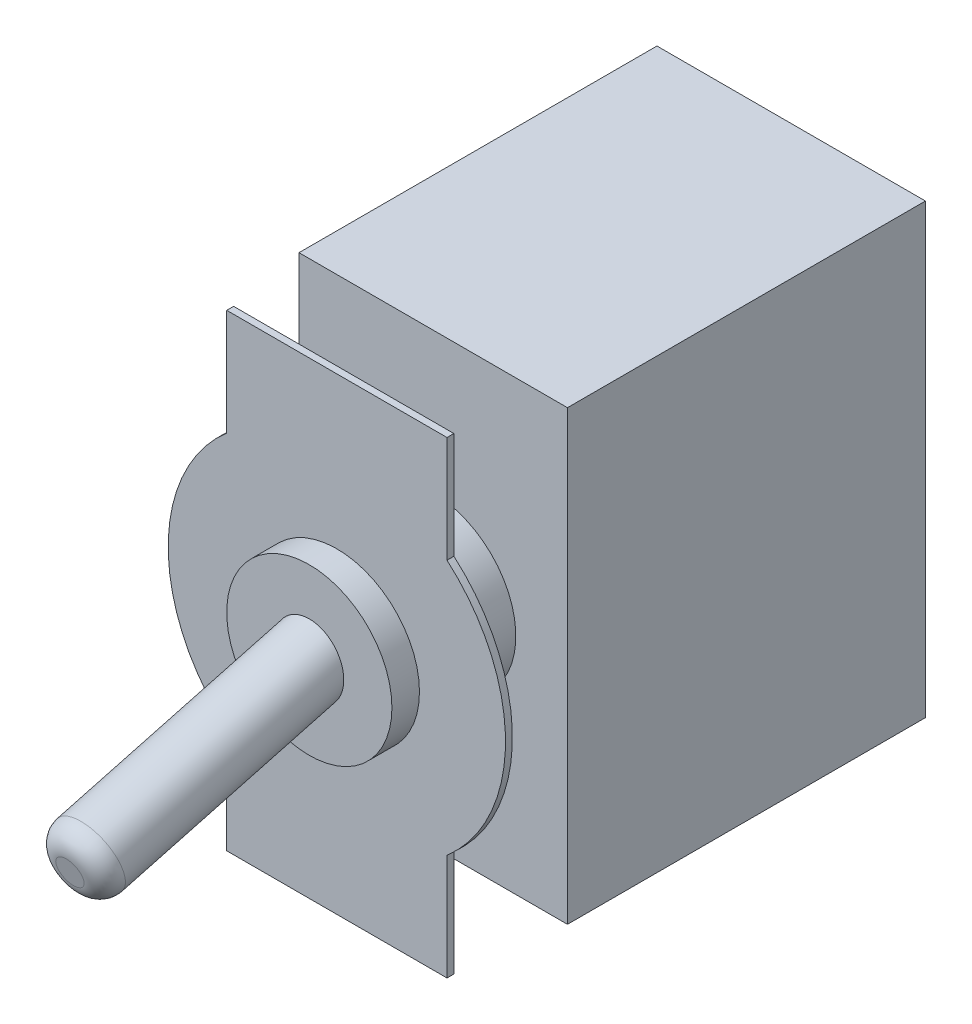
ISO-10303-21;
HEADER;
FILE_DESCRIPTION(('STEP AP214'),'2;1');
FILE_NAME('part.step','',(''),(''),'','','');
FILE_SCHEMA(('AUTOMOTIVE_DESIGN { 1 0 10303 214 1 1 1 1 }'));
ENDSEC;
DATA;
#1=APPLICATION_CONTEXT('core data for automotive mechanical design processes');
#2=APPLICATION_PROTOCOL_DEFINITION('international standard','automotive_design',2000,#1);
#3=PRODUCT_CONTEXT('',#1,'mechanical');
#4=PRODUCT('Part','Part','',(#3));
#5=PRODUCT_RELATED_PRODUCT_CATEGORY('part','',(#4));
#6=PRODUCT_DEFINITION_FORMATION('','',#4);
#7=PRODUCT_DEFINITION_CONTEXT('part definition',#1,'design');
#8=PRODUCT_DEFINITION('design','',#6,#7);
#9=PRODUCT_DEFINITION_SHAPE('','',#8);
#10=(LENGTH_UNIT() NAMED_UNIT(*) SI_UNIT(.MILLI.,.METRE.));
#11=(NAMED_UNIT(*) PLANE_ANGLE_UNIT() SI_UNIT($,.RADIAN.));
#12=(NAMED_UNIT(*) SI_UNIT($,.STERADIAN.) SOLID_ANGLE_UNIT());
#13=UNCERTAINTY_MEASURE_WITH_UNIT(LENGTH_MEASURE(1.E-05),#10,'distance_accuracy_value','');
#14=(GEOMETRIC_REPRESENTATION_CONTEXT(3) GLOBAL_UNCERTAINTY_ASSIGNED_CONTEXT((#13)) GLOBAL_UNIT_ASSIGNED_CONTEXT((#10,
#11,#12)) REPRESENTATION_CONTEXT('',''));
#15=CARTESIAN_POINT('',(0.,0.,0.));
#16=DIRECTION('',(0.,0.,1.));
#17=DIRECTION('',(1.,0.,0.));
#18=AXIS2_PLACEMENT_3D('',#15,#16,#17);
#19=CARTESIAN_POINT('',(0.,0.,35.));
#20=DIRECTION('',(0.,0.,-1.));
#21=DIRECTION('',(-1.,0.,0.));
#22=AXIS2_PLACEMENT_3D('',#19,#20,#21);
#23=CYLINDRICAL_SURFACE('',#22,6.);
#24=CARTESIAN_POINT('',(0.,0.,26.));
#25=DIRECTION('',(0.,0.,-1.));
#26=DIRECTION('',(-1.,0.,0.));
#27=AXIS2_PLACEMENT_3D('',#24,#25,#26);
#28=CIRCLE('',#27,6.);
#29=CARTESIAN_POINT('',(-6.,0.,26.));
#30=VERTEX_POINT('',#29);
#31=EDGE_CURVE('E238',#30,#30,#28,.F.);
#32=ORIENTED_EDGE('',*,*,#31,.T.);
#33=EDGE_LOOP('',(#32));
#34=FACE_BOUND('',#33,.T.);
#35=CARTESIAN_POINT('',(0.,0.,32.5));
#36=DIRECTION('',(0.,0.,1.));
#37=DIRECTION('',(1.,0.,0.));
#38=AXIS2_PLACEMENT_3D('',#35,#36,#37);
#39=CIRCLE('',#38,6.);
#40=CARTESIAN_POINT('',(6.,0.,32.5));
#41=VERTEX_POINT('',#40);
#42=EDGE_CURVE('E241',#41,#41,#39,.T.);
#43=ORIENTED_EDGE('',*,*,#42,.F.);
#44=EDGE_LOOP('',(#43));
#45=FACE_BOUND('',#44,.T.);
#46=ADVANCED_FACE('F38',(#34,#45),#23,.T.);
#47=CARTESIAN_POINT('',(9.75,-16.25,26.));
#48=DIRECTION('',(-1.,0.,0.));
#49=DIRECTION('',(0.,0.,1.));
#50=AXIS2_PLACEMENT_3D('',#47,#48,#49);
#51=PLANE('',#50);
#52=DIRECTION('',(0.,1.,0.));
#53=VECTOR('',#52,1.);
#54=CARTESIAN_POINT('',(9.75,-16.25,0.));
#55=LINE('',#54,#53);
#56=CARTESIAN_POINT('',(9.75,-16.25,0.));
#57=VERTEX_POINT('',#56);
#58=CARTESIAN_POINT('',(9.75,16.25,0.));
#59=VERTEX_POINT('',#58);
#60=EDGE_CURVE('E217',#57,#59,#55,.T.);
#61=ORIENTED_EDGE('',*,*,#60,.T.);
#62=DIRECTION('',(0.,0.,-1.));
#63=VECTOR('',#62,1.);
#64=CARTESIAN_POINT('',(9.75,16.25,26.));
#65=LINE('',#64,#63);
#66=CARTESIAN_POINT('',(9.75,16.25,26.));
#67=VERTEX_POINT('',#66);
#68=EDGE_CURVE('E236',#67,#59,#65,.T.);
#69=ORIENTED_EDGE('',*,*,#68,.F.);
#70=DIRECTION('',(0.,1.,0.));
#71=VECTOR('',#70,1.);
#72=CARTESIAN_POINT('',(9.75,-16.25,26.));
#73=LINE('',#72,#71);
#74=CARTESIAN_POINT('',(9.75,-16.25,26.));
#75=VERTEX_POINT('',#74);
#76=EDGE_CURVE('E218',#75,#67,#73,.T.);
#77=ORIENTED_EDGE('',*,*,#76,.F.);
#78=DIRECTION('',(0.,0.,-1.));
#79=VECTOR('',#78,1.);
#80=CARTESIAN_POINT('',(9.75,-16.25,26.));
#81=LINE('',#80,#79);
#82=EDGE_CURVE('E224',#75,#57,#81,.T.);
#83=ORIENTED_EDGE('',*,*,#82,.T.);
#84=EDGE_LOOP('',(#61,#69,#77,#83));
#85=FACE_BOUND('',#84,.T.);
#86=ADVANCED_FACE('F266',(#85),#51,.F.);
#87=CARTESIAN_POINT('',(-9.75,16.25,26.));
#88=DIRECTION('',(0.,-1.,0.));
#89=DIRECTION('',(0.,0.,-1.));
#90=AXIS2_PLACEMENT_3D('',#87,#88,#89);
#91=PLANE('',#90);
#92=DIRECTION('',(-1.,0.,0.));
#93=VECTOR('',#92,1.);
#94=CARTESIAN_POINT('',(-9.75,16.25,0.));
#95=LINE('',#94,#93);
#96=CARTESIAN_POINT('',(-9.75,16.25,0.));
#97=VERTEX_POINT('',#96);
#98=EDGE_CURVE('E227',#59,#97,#95,.T.);
#99=ORIENTED_EDGE('',*,*,#98,.T.);
#100=DIRECTION('',(0.,0.,-1.));
#101=VECTOR('',#100,1.);
#102=CARTESIAN_POINT('',(-9.75,16.25,26.));
#103=LINE('',#102,#101);
#104=CARTESIAN_POINT('',(-9.75,16.25,26.));
#105=VERTEX_POINT('',#104);
#106=EDGE_CURVE('E234',#105,#97,#103,.T.);
#107=ORIENTED_EDGE('',*,*,#106,.F.);
#108=DIRECTION('',(-1.,0.,0.));
#109=VECTOR('',#108,1.);
#110=CARTESIAN_POINT('',(-9.75,16.25,26.));
#111=LINE('',#110,#109);
#112=EDGE_CURVE('E87',#67,#105,#111,.T.);
#113=ORIENTED_EDGE('',*,*,#112,.F.);
#114=ORIENTED_EDGE('',*,*,#68,.T.);
#115=EDGE_LOOP('',(#99,#107,#113,#114));
#116=FACE_BOUND('',#115,.T.);
#117=ADVANCED_FACE('F272',(#116),#91,.F.);
#118=CARTESIAN_POINT('',(-9.75,-16.25,26.));
#119=DIRECTION('',(1.,0.,0.));
#120=DIRECTION('',(0.,0.,-1.));
#121=AXIS2_PLACEMENT_3D('',#118,#119,#120);
#122=PLANE('',#121);
#123=DIRECTION('',(0.,-1.,0.));
#124=VECTOR('',#123,1.);
#125=CARTESIAN_POINT('',(-9.75,-16.25,0.));
#126=LINE('',#125,#124);
#127=CARTESIAN_POINT('',(-9.75,-16.25,0.));
#128=VERTEX_POINT('',#127);
#129=EDGE_CURVE('E73',#97,#128,#126,.T.);
#130=ORIENTED_EDGE('',*,*,#129,.T.);
#131=DIRECTION('',(0.,0.,-1.));
#132=VECTOR('',#131,1.);
#133=CARTESIAN_POINT('',(-9.75,-16.25,26.));
#134=LINE('',#133,#132);
#135=CARTESIAN_POINT('',(-9.75,-16.25,26.));
#136=VERTEX_POINT('',#135);
#137=EDGE_CURVE('E232',#136,#128,#134,.T.);
#138=ORIENTED_EDGE('',*,*,#137,.F.);
#139=DIRECTION('',(0.,-1.,0.));
#140=VECTOR('',#139,1.);
#141=CARTESIAN_POINT('',(-9.75,-16.25,26.));
#142=LINE('',#141,#140);
#143=EDGE_CURVE('E221',#105,#136,#142,.T.);
#144=ORIENTED_EDGE('',*,*,#143,.F.);
#145=ORIENTED_EDGE('',*,*,#106,.T.);
#146=EDGE_LOOP('',(#130,#138,#144,#145));
#147=FACE_BOUND('',#146,.T.);
#148=ADVANCED_FACE('F343',(#147),#122,.F.);
#149=CARTESIAN_POINT('',(-9.75,-16.25,26.));
#150=DIRECTION('',(0.,1.,0.));
#151=DIRECTION('',(0.,0.,1.));
#152=AXIS2_PLACEMENT_3D('',#149,#150,#151);
#153=PLANE('',#152);
#154=DIRECTION('',(1.,0.,0.));
#155=VECTOR('',#154,1.);
#156=CARTESIAN_POINT('',(-9.75,-16.25,0.));
#157=LINE('',#156,#155);
#158=EDGE_CURVE('E79',#128,#57,#157,.T.);
#159=ORIENTED_EDGE('',*,*,#158,.T.);
#160=ORIENTED_EDGE('',*,*,#82,.F.);
#161=DIRECTION('',(1.,0.,0.));
#162=VECTOR('',#161,1.);
#163=CARTESIAN_POINT('',(-9.75,-16.25,26.));
#164=LINE('',#163,#162);
#165=EDGE_CURVE('E55',#136,#75,#164,.T.);
#166=ORIENTED_EDGE('',*,*,#165,.F.);
#167=ORIENTED_EDGE('',*,*,#137,.T.);
#168=EDGE_LOOP('',(#159,#160,#166,#167));
#169=FACE_BOUND('',#168,.T.);
#170=ADVANCED_FACE('F337',(#169),#153,.F.);
#171=CARTESIAN_POINT('',(0.,0.,26.));
#172=DIRECTION('',(0.,0.,-1.));
#173=DIRECTION('',(-1.,0.,0.));
#174=AXIS2_PLACEMENT_3D('',#171,#172,#173);
#175=PLANE('',#174);
#176=ORIENTED_EDGE('',*,*,#31,.F.);
#177=EDGE_LOOP('',(#176));
#178=FACE_BOUND('',#177,.T.);
#179=ORIENTED_EDGE('',*,*,#76,.T.);
#180=ORIENTED_EDGE('',*,*,#112,.T.);
#181=ORIENTED_EDGE('',*,*,#143,.T.);
#182=ORIENTED_EDGE('',*,*,#165,.T.);
#183=EDGE_LOOP('',(#179,#180,#181,#182));
#184=FACE_BOUND('',#183,.T.);
#185=ADVANCED_FACE('F331',(#178,#184),#175,.F.);
#186=CARTESIAN_POINT('',(0.,0.,0.));
#187=DIRECTION('',(0.,0.,-1.));
#188=DIRECTION('',(-1.,0.,0.));
#189=AXIS2_PLACEMENT_3D('',#186,#187,#188);
#190=PLANE('',#189);
#191=ORIENTED_EDGE('',*,*,#60,.F.);
#192=ORIENTED_EDGE('',*,*,#158,.F.);
#193=ORIENTED_EDGE('',*,*,#129,.F.);
#194=ORIENTED_EDGE('',*,*,#98,.F.);
#195=EDGE_LOOP('',(#191,#192,#193,#194));
#196=FACE_BOUND('',#195,.T.);
#197=ADVANCED_FACE('F324',(#196),#190,.T.);
#198=CARTESIAN_POINT('',(-8.,17.,32.5));
#199=DIRECTION('',(0.,1.,0.));
#200=DIRECTION('',(0.,0.,1.));
#201=AXIS2_PLACEMENT_3D('',#198,#199,#200);
#202=PLANE('',#201);
#203=DIRECTION('',(-1.,0.,0.));
#204=VECTOR('',#203,1.);
#205=CARTESIAN_POINT('',(-8.,17.,33.));
#206=LINE('',#205,#204);
#207=CARTESIAN_POINT('',(8.,17.,33.));
#208=VERTEX_POINT('',#207);
#209=CARTESIAN_POINT('',(-8.,17.,33.));
#210=VERTEX_POINT('',#209);
#211=EDGE_CURVE('E184',#208,#210,#206,.T.);
#212=ORIENTED_EDGE('',*,*,#211,.F.);
#213=DIRECTION('',(0.,0.,1.));
#214=VECTOR('',#213,1.);
#215=CARTESIAN_POINT('',(8.,17.,32.5));
#216=LINE('',#215,#214);
#217=CARTESIAN_POINT('',(8.,17.,32.5));
#218=VERTEX_POINT('',#217);
#219=EDGE_CURVE('E163',#218,#208,#216,.T.);
#220=ORIENTED_EDGE('',*,*,#219,.F.);
#221=DIRECTION('',(-1.,0.,0.));
#222=VECTOR('',#221,1.);
#223=CARTESIAN_POINT('',(-8.,17.,32.5));
#224=LINE('',#223,#222);
#225=CARTESIAN_POINT('',(-8.,17.,32.5));
#226=VERTEX_POINT('',#225);
#227=EDGE_CURVE('E156',#218,#226,#224,.T.);
#228=ORIENTED_EDGE('',*,*,#227,.T.);
#229=DIRECTION('',(0.,0.,1.));
#230=VECTOR('',#229,1.);
#231=CARTESIAN_POINT('',(-8.,17.,32.5));
#232=LINE('',#231,#230);
#233=EDGE_CURVE('E138',#226,#210,#232,.T.);
#234=ORIENTED_EDGE('',*,*,#233,.T.);
#235=EDGE_LOOP('',(#212,#220,#228,#234));
#236=FACE_BOUND('',#235,.T.);
#237=ADVANCED_FACE('F162',(#236),#202,.T.);
#238=CARTESIAN_POINT('',(8.,9.27698765763974,32.5));
#239=DIRECTION('',(1.,0.,0.));
#240=DIRECTION('',(0.,0.,-1.));
#241=AXIS2_PLACEMENT_3D('',#238,#239,#240);
#242=PLANE('',#241);
#243=DIRECTION('',(0.,1.,0.));
#244=VECTOR('',#243,1.);
#245=CARTESIAN_POINT('',(8.,9.27698765763974,33.));
#246=LINE('',#245,#244);
#247=CARTESIAN_POINT('',(8.,9.27698765763974,33.));
#248=VERTEX_POINT('',#247);
#249=EDGE_CURVE('E164',#248,#208,#246,.T.);
#250=ORIENTED_EDGE('',*,*,#249,.F.);
#251=DIRECTION('',(0.,0.,1.));
#252=VECTOR('',#251,1.);
#253=CARTESIAN_POINT('',(8.,9.27698765763974,32.5));
#254=LINE('',#253,#252);
#255=CARTESIAN_POINT('',(8.,9.27698765763974,32.5));
#256=VERTEX_POINT('',#255);
#257=EDGE_CURVE('E203',#256,#248,#254,.T.);
#258=ORIENTED_EDGE('',*,*,#257,.F.);
#259=DIRECTION('',(0.,1.,0.));
#260=VECTOR('',#259,1.);
#261=CARTESIAN_POINT('',(8.,9.27698765763974,32.5));
#262=LINE('',#261,#260);
#263=EDGE_CURVE('E149',#256,#218,#262,.T.);
#264=ORIENTED_EDGE('',*,*,#263,.T.);
#265=ORIENTED_EDGE('',*,*,#219,.T.);
#266=EDGE_LOOP('',(#250,#258,#264,#265));
#267=FACE_BOUND('',#266,.T.);
#268=ADVANCED_FACE('F296',(#267),#242,.T.);
#269=CARTESIAN_POINT('',(0.,0.,32.5));
#270=DIRECTION('',(0.,0.,1.));
#271=DIRECTION('',(1.,0.,0.));
#272=AXIS2_PLACEMENT_3D('',#269,#270,#271);
#273=CYLINDRICAL_SURFACE('',#272,12.25);
#274=CARTESIAN_POINT('',(0.,0.,33.));
#275=DIRECTION('',(0.,0.,1.));
#276=DIRECTION('',(1.,0.,0.));
#277=AXIS2_PLACEMENT_3D('',#274,#275,#276);
#278=CIRCLE('',#277,12.25);
#279=CARTESIAN_POINT('',(8.,-9.27698765763974,33.));
#280=VERTEX_POINT('',#279);
#281=EDGE_CURVE('E167',#280,#248,#278,.T.);
#282=ORIENTED_EDGE('',*,*,#281,.F.);
#283=DIRECTION('',(0.,0.,1.));
#284=VECTOR('',#283,1.);
#285=CARTESIAN_POINT('',(8.,-9.27698765763974,32.5));
#286=LINE('',#285,#284);
#287=CARTESIAN_POINT('',(8.,-9.27698765763974,32.5));
#288=VERTEX_POINT('',#287);
#289=EDGE_CURVE('E205',#288,#280,#286,.T.);
#290=ORIENTED_EDGE('',*,*,#289,.F.);
#291=CARTESIAN_POINT('',(0.,0.,32.5));
#292=DIRECTION('',(0.,0.,1.));
#293=DIRECTION('',(1.,0.,0.));
#294=AXIS2_PLACEMENT_3D('',#291,#292,#293);
#295=CIRCLE('',#294,12.25);
#296=EDGE_CURVE('E180',#288,#256,#295,.T.);
#297=ORIENTED_EDGE('',*,*,#296,.T.);
#298=ORIENTED_EDGE('',*,*,#257,.T.);
#299=EDGE_LOOP('',(#282,#290,#297,#298));
#300=FACE_BOUND('',#299,.T.);
#301=ADVANCED_FACE('F329',(#300),#273,.T.);
#302=CARTESIAN_POINT('',(8.,-17.,32.5));
#303=DIRECTION('',(1.,0.,0.));
#304=DIRECTION('',(0.,0.,-1.));
#305=AXIS2_PLACEMENT_3D('',#302,#303,#304);
#306=PLANE('',#305);
#307=DIRECTION('',(0.,1.,0.));
#308=VECTOR('',#307,1.);
#309=CARTESIAN_POINT('',(8.,-17.,33.));
#310=LINE('',#309,#308);
#311=CARTESIAN_POINT('',(8.,-17.,33.));
#312=VERTEX_POINT('',#311);
#313=EDGE_CURVE('E196',#312,#280,#310,.T.);
#314=ORIENTED_EDGE('',*,*,#313,.F.);
#315=DIRECTION('',(0.,0.,1.));
#316=VECTOR('',#315,1.);
#317=CARTESIAN_POINT('',(8.,-17.,32.5));
#318=LINE('',#317,#316);
#319=CARTESIAN_POINT('',(8.,-17.,32.5));
#320=VERTEX_POINT('',#319);
#321=EDGE_CURVE('E207',#320,#312,#318,.T.);
#322=ORIENTED_EDGE('',*,*,#321,.F.);
#323=DIRECTION('',(0.,1.,0.));
#324=VECTOR('',#323,1.);
#325=CARTESIAN_POINT('',(8.,-17.,32.5));
#326=LINE('',#325,#324);
#327=EDGE_CURVE('E177',#320,#288,#326,.T.);
#328=ORIENTED_EDGE('',*,*,#327,.T.);
#329=ORIENTED_EDGE('',*,*,#289,.T.);
#330=EDGE_LOOP('',(#314,#322,#328,#329));
#331=FACE_BOUND('',#330,.T.);
#332=ADVANCED_FACE('F303',(#331),#306,.T.);
#333=CARTESIAN_POINT('',(-8.,-17.,32.5));
#334=DIRECTION('',(0.,-1.,0.));
#335=DIRECTION('',(0.,0.,-1.));
#336=AXIS2_PLACEMENT_3D('',#333,#334,#335);
#337=PLANE('',#336);
#338=DIRECTION('',(1.,0.,0.));
#339=VECTOR('',#338,1.);
#340=CARTESIAN_POINT('',(-8.,-17.,33.));
#341=LINE('',#340,#339);
#342=CARTESIAN_POINT('',(-8.,-17.,33.));
#343=VERTEX_POINT('',#342);
#344=EDGE_CURVE('E193',#343,#312,#341,.T.);
#345=ORIENTED_EDGE('',*,*,#344,.F.);
#346=DIRECTION('',(0.,0.,1.));
#347=VECTOR('',#346,1.);
#348=CARTESIAN_POINT('',(-8.,-17.,32.5));
#349=LINE('',#348,#347);
#350=CARTESIAN_POINT('',(-8.,-17.,32.5));
#351=VERTEX_POINT('',#350);
#352=EDGE_CURVE('E209',#351,#343,#349,.T.);
#353=ORIENTED_EDGE('',*,*,#352,.F.);
#354=DIRECTION('',(1.,0.,0.));
#355=VECTOR('',#354,1.);
#356=CARTESIAN_POINT('',(-8.,-17.,32.5));
#357=LINE('',#356,#355);
#358=EDGE_CURVE('E174',#351,#320,#357,.T.);
#359=ORIENTED_EDGE('',*,*,#358,.T.);
#360=ORIENTED_EDGE('',*,*,#321,.T.);
#361=EDGE_LOOP('',(#345,#353,#359,#360));
#362=FACE_BOUND('',#361,.T.);
#363=ADVANCED_FACE('F306',(#362),#337,.T.);
#364=CARTESIAN_POINT('',(-8.,-17.,32.5));
#365=DIRECTION('',(-1.,0.,0.));
#366=DIRECTION('',(0.,0.,1.));
#367=AXIS2_PLACEMENT_3D('',#364,#365,#366);
#368=PLANE('',#367);
#369=DIRECTION('',(0.,-1.,0.));
#370=VECTOR('',#369,1.);
#371=CARTESIAN_POINT('',(-8.,-17.,33.));
#372=LINE('',#371,#370);
#373=CARTESIAN_POINT('',(-8.,-9.27698765763973,33.));
#374=VERTEX_POINT('',#373);
#375=EDGE_CURVE('E190',#374,#343,#372,.T.);
#376=ORIENTED_EDGE('',*,*,#375,.F.);
#377=DIRECTION('',(0.,0.,1.));
#378=VECTOR('',#377,1.);
#379=CARTESIAN_POINT('',(-8.,-9.27698765763973,32.5));
#380=LINE('',#379,#378);
#381=CARTESIAN_POINT('',(-8.,-9.27698765763973,32.5));
#382=VERTEX_POINT('',#381);
#383=EDGE_CURVE('E211',#382,#374,#380,.T.);
#384=ORIENTED_EDGE('',*,*,#383,.F.);
#385=DIRECTION('',(0.,-1.,0.));
#386=VECTOR('',#385,1.);
#387=CARTESIAN_POINT('',(-8.,-17.,32.5));
#388=LINE('',#387,#386);
#389=EDGE_CURVE('E171',#382,#351,#388,.T.);
#390=ORIENTED_EDGE('',*,*,#389,.T.);
#391=ORIENTED_EDGE('',*,*,#352,.T.);
#392=EDGE_LOOP('',(#376,#384,#390,#391));
#393=FACE_BOUND('',#392,.T.);
#394=ADVANCED_FACE('F309',(#393),#368,.T.);
#395=CARTESIAN_POINT('',(0.,0.,32.5));
#396=DIRECTION('',(0.,0.,1.));
#397=DIRECTION('',(1.,0.,0.));
#398=AXIS2_PLACEMENT_3D('',#395,#396,#397);
#399=CYLINDRICAL_SURFACE('',#398,12.25);
#400=CARTESIAN_POINT('',(0.,0.,33.));
#401=DIRECTION('',(0.,0.,1.));
#402=DIRECTION('',(1.,0.,0.));
#403=AXIS2_PLACEMENT_3D('',#400,#401,#402);
#404=CIRCLE('',#403,12.25);
#405=CARTESIAN_POINT('',(-8.,9.27698765763974,33.));
#406=VERTEX_POINT('',#405);
#407=EDGE_CURVE('E187',#406,#374,#404,.T.);
#408=ORIENTED_EDGE('',*,*,#407,.F.);
#409=DIRECTION('',(0.,0.,1.));
#410=VECTOR('',#409,1.);
#411=CARTESIAN_POINT('',(-8.,9.27698765763974,32.5));
#412=LINE('',#411,#410);
#413=CARTESIAN_POINT('',(-8.,9.27698765763974,32.5));
#414=VERTEX_POINT('',#413);
#415=EDGE_CURVE('E148',#414,#406,#412,.T.);
#416=ORIENTED_EDGE('',*,*,#415,.F.);
#417=CARTESIAN_POINT('',(0.,0.,32.5));
#418=DIRECTION('',(0.,0.,1.));
#419=DIRECTION('',(1.,0.,0.));
#420=AXIS2_PLACEMENT_3D('',#417,#418,#419);
#421=CIRCLE('',#420,12.25);
#422=EDGE_CURVE('E160',#414,#382,#421,.T.);
#423=ORIENTED_EDGE('',*,*,#422,.T.);
#424=ORIENTED_EDGE('',*,*,#383,.T.);
#425=EDGE_LOOP('',(#408,#416,#423,#424));
#426=FACE_BOUND('',#425,.T.);
#427=ADVANCED_FACE('F312',(#426),#399,.T.);
#428=CARTESIAN_POINT('',(-8.,9.27698765763974,32.5));
#429=DIRECTION('',(-1.,0.,0.));
#430=DIRECTION('',(0.,0.,1.));
#431=AXIS2_PLACEMENT_3D('',#428,#429,#430);
#432=PLANE('',#431);
#433=DIRECTION('',(0.,-1.,0.));
#434=VECTOR('',#433,1.);
#435=CARTESIAN_POINT('',(-8.,9.27698765763974,33.));
#436=LINE('',#435,#434);
#437=EDGE_CURVE('E143',#210,#406,#436,.T.);
#438=ORIENTED_EDGE('',*,*,#437,.F.);
#439=ORIENTED_EDGE('',*,*,#233,.F.);
#440=DIRECTION('',(0.,-1.,0.));
#441=VECTOR('',#440,1.);
#442=CARTESIAN_POINT('',(-8.,9.27698765763974,32.5));
#443=LINE('',#442,#441);
#444=EDGE_CURVE('E141',#226,#414,#443,.T.);
#445=ORIENTED_EDGE('',*,*,#444,.T.);
#446=ORIENTED_EDGE('',*,*,#415,.T.);
#447=EDGE_LOOP('',(#438,#439,#445,#446));
#448=FACE_BOUND('',#447,.T.);
#449=ADVANCED_FACE('F140',(#448),#432,.T.);
#450=CARTESIAN_POINT('',(0.,0.,32.5));
#451=DIRECTION('',(0.,0.,1.));
#452=DIRECTION('',(1.,0.,0.));
#453=AXIS2_PLACEMENT_3D('',#450,#451,#452);
#454=PLANE('',#453);
#455=ORIENTED_EDGE('',*,*,#42,.T.);
#456=EDGE_LOOP('',(#455));
#457=FACE_BOUND('',#456,.T.);
#458=ORIENTED_EDGE('',*,*,#227,.F.);
#459=ORIENTED_EDGE('',*,*,#263,.F.);
#460=ORIENTED_EDGE('',*,*,#296,.F.);
#461=ORIENTED_EDGE('',*,*,#327,.F.);
#462=ORIENTED_EDGE('',*,*,#358,.F.);
#463=ORIENTED_EDGE('',*,*,#389,.F.);
#464=ORIENTED_EDGE('',*,*,#422,.F.);
#465=ORIENTED_EDGE('',*,*,#444,.F.);
#466=EDGE_LOOP('',(#458,#459,#460,#461,#462,#463,#464,#465));
#467=FACE_BOUND('',#466,.T.);
#468=ADVANCED_FACE('F154',(#457,#467),#454,.F.);
#469=CARTESIAN_POINT('',(0.,0.,33.));
#470=DIRECTION('',(0.,0.,1.));
#471=DIRECTION('',(1.,0.,0.));
#472=AXIS2_PLACEMENT_3D('',#469,#470,#471);
#473=PLANE('',#472);
#474=CARTESIAN_POINT('',(0.,0.,33.));
#475=DIRECTION('',(0.,0.,1.));
#476=DIRECTION('',(1.,0.,0.));
#477=AXIS2_PLACEMENT_3D('',#474,#475,#476);
#478=CIRCLE('',#477,6.);
#479=CARTESIAN_POINT('',(6.,0.,33.));
#480=VERTEX_POINT('',#479);
#481=EDGE_CURVE('E202',#480,#480,#478,.T.);
#482=ORIENTED_EDGE('',*,*,#481,.F.);
#483=EDGE_LOOP('',(#482));
#484=FACE_BOUND('',#483,.T.);
#485=ORIENTED_EDGE('',*,*,#211,.T.);
#486=ORIENTED_EDGE('',*,*,#437,.T.);
#487=ORIENTED_EDGE('',*,*,#407,.T.);
#488=ORIENTED_EDGE('',*,*,#375,.T.);
#489=ORIENTED_EDGE('',*,*,#344,.T.);
#490=ORIENTED_EDGE('',*,*,#313,.T.);
#491=ORIENTED_EDGE('',*,*,#281,.T.);
#492=ORIENTED_EDGE('',*,*,#249,.T.);
#493=EDGE_LOOP('',(#485,#486,#487,#488,#489,#490,#491,#492));
#494=FACE_BOUND('',#493,.T.);
#495=ADVANCED_FACE('F283',(#484,#494),#473,.T.);
#496=CARTESIAN_POINT('',(0.,0.,35.));
#497=DIRECTION('',(0.,0.,1.));
#498=DIRECTION('',(1.,0.,0.));
#499=AXIS2_PLACEMENT_3D('',#496,#497,#498);
#500=PLANE('',#499);
#501=CARTESIAN_POINT('',(0.,0.,35.));
#502=DIRECTION('',(0.,0.,1.));
#503=DIRECTION('',(0.,-1.,0.));
#504=AXIS2_PLACEMENT_3D('',#501,#502,#503);
#505=ELLIPSE('',#504,2.58819045102521,2.5);
#506=CARTESIAN_POINT('',(0.,-2.58819045102516,35.));
#507=VERTEX_POINT('',#506);
#508=EDGE_CURVE('E246',#507,#507,#505,.T.);
#509=ORIENTED_EDGE('',*,*,#508,.F.);
#510=EDGE_LOOP('',(#509));
#511=FACE_BOUND('',#510,.T.);
#512=CARTESIAN_POINT('',(0.,0.,35.));
#513=DIRECTION('',(0.,0.,1.));
#514=DIRECTION('',(1.,0.,0.));
#515=AXIS2_PLACEMENT_3D('',#512,#513,#514);
#516=CIRCLE('',#515,6.);
#517=CARTESIAN_POINT('',(6.,0.,35.));
#518=VERTEX_POINT('',#517);
#519=EDGE_CURVE('E214',#518,#518,#516,.T.);
#520=ORIENTED_EDGE('',*,*,#519,.T.);
#521=EDGE_LOOP('',(#520));
#522=FACE_BOUND('',#521,.T.);
#523=ADVANCED_FACE('F278',(#511,#522),#500,.T.);
#524=ORIENTED_EDGE('',*,*,#481,.T.);
#525=EDGE_LOOP('',(#524));
#526=FACE_BOUND('',#525,.T.);
#527=ORIENTED_EDGE('',*,*,#519,.F.);
#528=EDGE_LOOP('',(#527));
#529=FACE_BOUND('',#528,.T.);
#530=ADVANCED_FACE('F261',(#526,#529),#23,.T.);
#531=CARTESIAN_POINT('',(0.,-4.65874281184536,52.3866648732032));
#532=DIRECTION('',(0.,-0.258819045102522,0.965925826289068));
#533=DIRECTION('',(0.,-0.965925826289068,-0.258819045102522));
#534=AXIS2_PLACEMENT_3D('',#531,#532,#533);
#535=PLANE('',#534);
#536=CARTESIAN_POINT('',(0.,-4.65874281184535,52.3866648732032));
#537=DIRECTION('',(0.,-0.258819045102522,0.965925826289068));
#538=DIRECTION('',(0.,-0.965925826289068,-0.258819045102522));
#539=AXIS2_PLACEMENT_3D('',#536,#537,#538);
#540=CIRCLE('',#539,1.);
#541=CARTESIAN_POINT('',(0.,-5.62466863813442,52.1278458281007));
#542=VERTEX_POINT('',#541);
#543=EDGE_CURVE('E47',#542,#542,#540,.T.);
#544=ORIENTED_EDGE('',*,*,#543,.T.);
#545=EDGE_LOOP('',(#544));
#546=FACE_BOUND('',#545,.T.);
#547=ADVANCED_FACE('F251',(#546),#535,.T.);
#548=CARTESIAN_POINT('',(0.,0.441387261543996,33.3527203141043));
#549=DIRECTION('',(0.,-0.258819045102522,0.965925826289068));
#550=DIRECTION('',(0.,-0.965925826289068,-0.258819045102522));
#551=AXIS2_PLACEMENT_3D('',#548,#549,#550);
#552=CYLINDRICAL_SURFACE('',#551,2.5);
#553=CARTESIAN_POINT('',(0.,-4.27051424419157,50.9377761337696));
#554=DIRECTION('',(0.,-0.258819045102522,0.965925826289068));
#555=DIRECTION('',(0.,-0.965925826289068,-0.258819045102522));
#556=AXIS2_PLACEMENT_3D('',#553,#554,#555);
#557=CIRCLE('',#556,2.5);
#558=CARTESIAN_POINT('',(0.,-6.68532880991424,50.2907285210133));
#559=VERTEX_POINT('',#558);
#560=EDGE_CURVE('E12',#559,#559,#557,.F.);
#561=ORIENTED_EDGE('',*,*,#560,.T.);
#562=EDGE_LOOP('',(#561));
#563=FACE_BOUND('',#562,.T.);
#564=ORIENTED_EDGE('',*,*,#508,.T.);
#565=EDGE_LOOP('',(#564));
#566=FACE_BOUND('',#565,.T.);
#567=ADVANCED_FACE('F254',(#563,#566),#552,.T.);
#568=CARTESIAN_POINT('',(0.,-4.27051424419157,50.9377761337696));
#569=DIRECTION('',(0.,-0.258819045102522,0.965925826289068));
#570=DIRECTION('',(0.,-0.965925826289068,-0.258819045102522));
#571=AXIS2_PLACEMENT_3D('',#568,#569,#570);
#572=DEGENERATE_TOROIDAL_SURFACE('',#571,1.,1.5,.T.);
#573=ORIENTED_EDGE('',*,*,#560,.F.);
#574=EDGE_LOOP('',(#573));
#575=FACE_BOUND('',#574,.T.);
#576=ORIENTED_EDGE('',*,*,#543,.F.);
#577=EDGE_LOOP('',(#576));
#578=FACE_BOUND('',#577,.T.);
#579=ADVANCED_FACE('F40',(#575,#578),#572,.T.);
#580=CLOSED_SHELL('',(#46,#86,#117,#148,#170,#185,#197,#237,#268,#301,#332,#363,#394,#427,#449,
#468,#495,#523,#530,#547,#567,#579));
#581=MANIFOLD_SOLID_BREP('B2',#580);
#582=ADVANCED_BREP_SHAPE_REPRESENTATION('',(#18,#581),#14);
#583=SHAPE_DEFINITION_REPRESENTATION(#9,#582);
ENDSEC;
END-ISO-10303-21;
